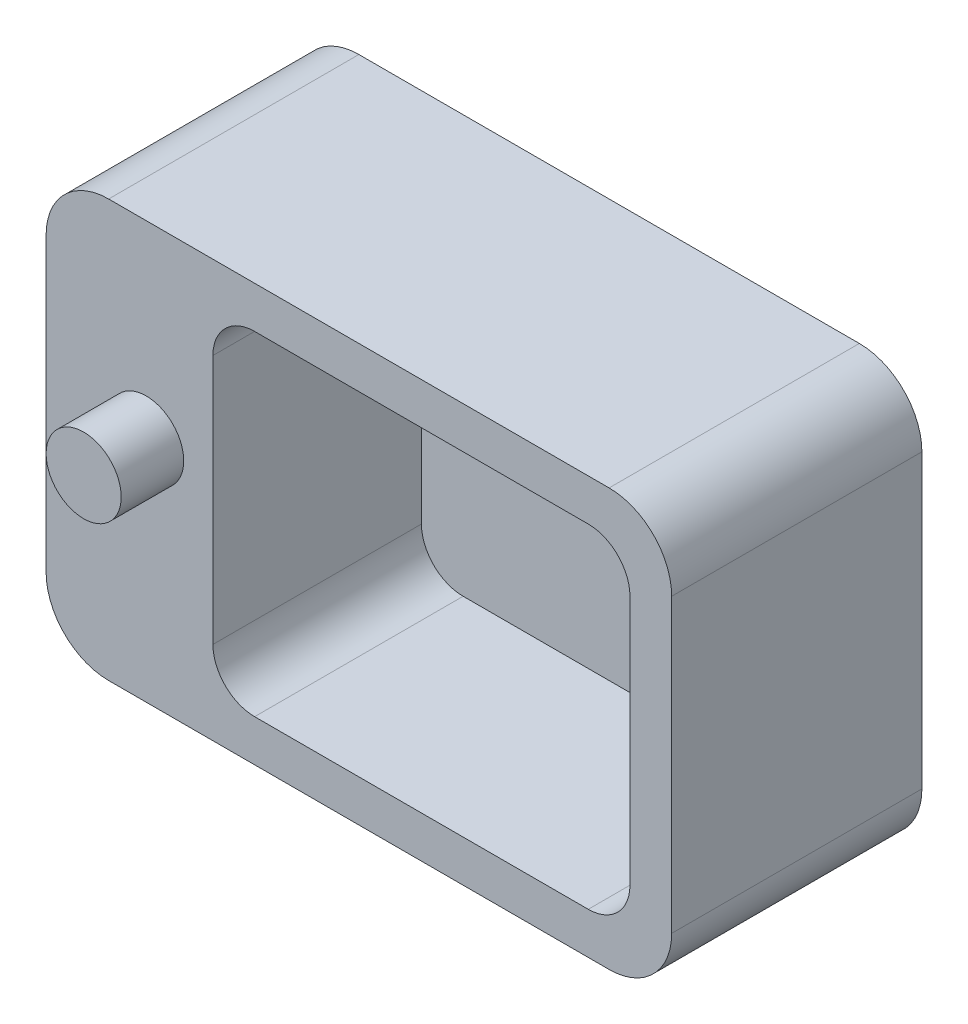
ISO-10303-21;
HEADER;
FILE_DESCRIPTION(('STEP AP214'),'2;1');
FILE_NAME('part.step','',(''),(''),'','','');
FILE_SCHEMA(('AUTOMOTIVE_DESIGN { 1 0 10303 214 1 1 1 1 }'));
ENDSEC;
DATA;
#1=APPLICATION_CONTEXT('core data for automotive mechanical design processes');
#2=APPLICATION_PROTOCOL_DEFINITION('international standard','automotive_design',2000,#1);
#3=PRODUCT_CONTEXT('',#1,'mechanical');
#4=PRODUCT('Part','Part','',(#3));
#5=PRODUCT_RELATED_PRODUCT_CATEGORY('part','',(#4));
#6=PRODUCT_DEFINITION_FORMATION('','',#4);
#7=PRODUCT_DEFINITION_CONTEXT('part definition',#1,'design');
#8=PRODUCT_DEFINITION('design','',#6,#7);
#9=PRODUCT_DEFINITION_SHAPE('','',#8);
#10=(LENGTH_UNIT() NAMED_UNIT(*) SI_UNIT(.MILLI.,.METRE.));
#11=(NAMED_UNIT(*) PLANE_ANGLE_UNIT() SI_UNIT($,.RADIAN.));
#12=(NAMED_UNIT(*) SI_UNIT($,.STERADIAN.) SOLID_ANGLE_UNIT());
#13=UNCERTAINTY_MEASURE_WITH_UNIT(LENGTH_MEASURE(1.E-05),#10,'distance_accuracy_value','');
#14=(GEOMETRIC_REPRESENTATION_CONTEXT(3) GLOBAL_UNCERTAINTY_ASSIGNED_CONTEXT((#13)) GLOBAL_UNIT_ASSIGNED_CONTEXT((#10,
#11,#12)) REPRESENTATION_CONTEXT('',''));
#15=CARTESIAN_POINT('',(0.,0.,0.));
#16=DIRECTION('',(0.,0.,1.));
#17=DIRECTION('',(1.,0.,0.));
#18=AXIS2_PLACEMENT_3D('',#15,#16,#17);
#19=CARTESIAN_POINT('',(135.,15.,60.));
#20=DIRECTION('',(0.,0.,-1.));
#21=DIRECTION('',(-1.,0.,0.));
#22=AXIS2_PLACEMENT_3D('',#19,#20,#21);
#23=PLANE('',#22);
#24=CARTESIAN_POINT('',(135.,15.,60.));
#25=DIRECTION('',(0.,0.,1.));
#26=DIRECTION('',(-1.,0.,0.));
#27=AXIS2_PLACEMENT_3D('',#24,#25,#26);
#28=CIRCLE('',#27,15.);
#29=CARTESIAN_POINT('',(135.,0.,60.));
#30=VERTEX_POINT('',#29);
#31=CARTESIAN_POINT('',(150.,15.,60.));
#32=VERTEX_POINT('',#31);
#33=EDGE_CURVE('E241',#30,#32,#28,.T.);
#34=ORIENTED_EDGE('',*,*,#33,.T.);
#35=DIRECTION('',(0.,1.,0.));
#36=VECTOR('',#35,1.);
#37=CARTESIAN_POINT('',(150.,15.,60.));
#38=LINE('',#37,#36);
#39=CARTESIAN_POINT('',(150.,85.,60.));
#40=VERTEX_POINT('',#39);
#41=EDGE_CURVE('E243',#32,#40,#38,.T.);
#42=ORIENTED_EDGE('',*,*,#41,.T.);
#43=CARTESIAN_POINT('',(135.,85.,60.));
#44=DIRECTION('',(0.,0.,1.));
#45=DIRECTION('',(1.,0.,0.));
#46=AXIS2_PLACEMENT_3D('',#43,#44,#45);
#47=CIRCLE('',#46,15.);
#48=CARTESIAN_POINT('',(135.,100.,60.));
#49=VERTEX_POINT('',#48);
#50=EDGE_CURVE('E245',#40,#49,#47,.T.);
#51=ORIENTED_EDGE('',*,*,#50,.T.);
#52=DIRECTION('',(-1.,0.,0.));
#53=VECTOR('',#52,1.);
#54=CARTESIAN_POINT('',(15.,100.,60.));
#55=LINE('',#54,#53);
#56=CARTESIAN_POINT('',(15.,100.,60.));
#57=VERTEX_POINT('',#56);
#58=EDGE_CURVE('E247',#49,#57,#55,.T.);
#59=ORIENTED_EDGE('',*,*,#58,.T.);
#60=CARTESIAN_POINT('',(15.,85.,60.));
#61=DIRECTION('',(0.,0.,1.));
#62=DIRECTION('',(1.,0.,0.));
#63=AXIS2_PLACEMENT_3D('',#60,#61,#62);
#64=CIRCLE('',#63,15.);
#65=CARTESIAN_POINT('',(0.,85.,60.));
#66=VERTEX_POINT('',#65);
#67=EDGE_CURVE('E249',#57,#66,#64,.T.);
#68=ORIENTED_EDGE('',*,*,#67,.T.);
#69=DIRECTION('',(0.,-1.,0.));
#70=VECTOR('',#69,1.);
#71=CARTESIAN_POINT('',(0.,15.,60.));
#72=LINE('',#71,#70);
#73=CARTESIAN_POINT('',(0.,15.,60.));
#74=VERTEX_POINT('',#73);
#75=EDGE_CURVE('E251',#66,#74,#72,.T.);
#76=ORIENTED_EDGE('',*,*,#75,.T.);
#77=CARTESIAN_POINT('',(15.,15.,60.));
#78=DIRECTION('',(0.,0.,1.));
#79=DIRECTION('',(1.,0.,0.));
#80=AXIS2_PLACEMENT_3D('',#77,#78,#79);
#81=CIRCLE('',#80,15.);
#82=CARTESIAN_POINT('',(15.,0.,60.));
#83=VERTEX_POINT('',#82);
#84=EDGE_CURVE('E253',#74,#83,#81,.T.);
#85=ORIENTED_EDGE('',*,*,#84,.T.);
#86=DIRECTION('',(1.,0.,0.));
#87=VECTOR('',#86,1.);
#88=CARTESIAN_POINT('',(15.,0.,60.));
#89=LINE('',#88,#87);
#90=EDGE_CURVE('E61',#83,#30,#89,.T.);
#91=ORIENTED_EDGE('',*,*,#90,.T.);
#92=EDGE_LOOP('',(#34,#42,#51,#59,#68,#76,#85,#91));
#93=FACE_BOUND('',#92,.T.);
#94=DIRECTION('',(0.,1.,0.));
#95=VECTOR('',#94,1.);
#96=CARTESIAN_POINT('',(140.,20.,60.));
#97=LINE('',#96,#95);
#98=CARTESIAN_POINT('',(140.,20.,60.));
#99=VERTEX_POINT('',#98);
#100=CARTESIAN_POINT('',(140.,80.,60.));
#101=VERTEX_POINT('',#100);
#102=EDGE_CURVE('E167',#99,#101,#97,.T.);
#103=ORIENTED_EDGE('',*,*,#102,.F.);
#104=CARTESIAN_POINT('',(130.,20.,60.));
#105=DIRECTION('',(0.,0.,1.));
#106=DIRECTION('',(-1.,0.,0.));
#107=AXIS2_PLACEMENT_3D('',#104,#105,#106);
#108=CIRCLE('',#107,10.);
#109=CARTESIAN_POINT('',(130.,10.,60.));
#110=VERTEX_POINT('',#109);
#111=EDGE_CURVE('E53',#110,#99,#108,.T.);
#112=ORIENTED_EDGE('',*,*,#111,.F.);
#113=DIRECTION('',(1.,0.,0.));
#114=VECTOR('',#113,1.);
#115=CARTESIAN_POINT('',(50.,10.,60.));
#116=LINE('',#115,#114);
#117=CARTESIAN_POINT('',(50.,10.,60.));
#118=VERTEX_POINT('',#117);
#119=EDGE_CURVE('E188',#118,#110,#116,.T.);
#120=ORIENTED_EDGE('',*,*,#119,.F.);
#121=CARTESIAN_POINT('',(50.,20.,60.));
#122=DIRECTION('',(0.,0.,1.));
#123=DIRECTION('',(1.,0.,0.));
#124=AXIS2_PLACEMENT_3D('',#121,#122,#123);
#125=CIRCLE('',#124,10.);
#126=CARTESIAN_POINT('',(40.,20.,60.));
#127=VERTEX_POINT('',#126);
#128=EDGE_CURVE('E185',#127,#118,#125,.T.);
#129=ORIENTED_EDGE('',*,*,#128,.F.);
#130=DIRECTION('',(0.,-1.,0.));
#131=VECTOR('',#130,1.);
#132=CARTESIAN_POINT('',(40.,80.,60.));
#133=LINE('',#132,#131);
#134=CARTESIAN_POINT('',(40.,80.,60.));
#135=VERTEX_POINT('',#134);
#136=EDGE_CURVE('E182',#135,#127,#133,.T.);
#137=ORIENTED_EDGE('',*,*,#136,.F.);
#138=CARTESIAN_POINT('',(50.,80.,60.));
#139=DIRECTION('',(0.,0.,1.));
#140=DIRECTION('',(1.,0.,0.));
#141=AXIS2_PLACEMENT_3D('',#138,#139,#140);
#142=CIRCLE('',#141,10.);
#143=CARTESIAN_POINT('',(50.,90.,60.));
#144=VERTEX_POINT('',#143);
#145=EDGE_CURVE('E176',#144,#135,#142,.T.);
#146=ORIENTED_EDGE('',*,*,#145,.F.);
#147=DIRECTION('',(-1.,0.,0.));
#148=VECTOR('',#147,1.);
#149=CARTESIAN_POINT('',(130.,90.,60.));
#150=LINE('',#149,#148);
#151=CARTESIAN_POINT('',(130.,90.,60.));
#152=VERTEX_POINT('',#151);
#153=EDGE_CURVE('E174',#152,#144,#150,.T.);
#154=ORIENTED_EDGE('',*,*,#153,.F.);
#155=CARTESIAN_POINT('',(130.,80.,60.));
#156=DIRECTION('',(0.,0.,1.));
#157=DIRECTION('',(-1.,0.,0.));
#158=AXIS2_PLACEMENT_3D('',#155,#156,#157);
#159=CIRCLE('',#158,10.);
#160=EDGE_CURVE('E156',#101,#152,#159,.T.);
#161=ORIENTED_EDGE('',*,*,#160,.F.);
#162=EDGE_LOOP('',(#103,#112,#120,#129,#137,#146,#154,#161));
#163=FACE_BOUND('',#162,.T.);
#164=CARTESIAN_POINT('',(24.,54.61,60.));
#165=DIRECTION('',(0.,0.,-1.));
#166=DIRECTION('',(-1.,0.,0.));
#167=AXIS2_PLACEMENT_3D('',#164,#165,#166);
#168=CIRCLE('',#167,9.00000000000001);
#169=CARTESIAN_POINT('',(15.,54.61,60.));
#170=VERTEX_POINT('',#169);
#171=EDGE_CURVE('E11',#170,#170,#168,.F.);
#172=ORIENTED_EDGE('',*,*,#171,.F.);
#173=EDGE_LOOP('',(#172));
#174=FACE_BOUND('',#173,.T.);
#175=ADVANCED_FACE('F38',(#93,#163,#174),#23,.F.);
#176=CARTESIAN_POINT('',(135.,15.,60.));
#177=DIRECTION('',(0.,0.,-1.));
#178=DIRECTION('',(-1.,0.,0.));
#179=AXIS2_PLACEMENT_3D('',#176,#177,#178);
#180=CYLINDRICAL_SURFACE('',#179,15.);
#181=CARTESIAN_POINT('',(135.,15.,0.));
#182=DIRECTION('',(0.,0.,1.));
#183=DIRECTION('',(-1.,0.,0.));
#184=AXIS2_PLACEMENT_3D('',#181,#182,#183);
#185=CIRCLE('',#184,15.);
#186=CARTESIAN_POINT('',(135.,0.,0.));
#187=VERTEX_POINT('',#186);
#188=CARTESIAN_POINT('',(150.,15.,0.));
#189=VERTEX_POINT('',#188);
#190=EDGE_CURVE('E214',#187,#189,#185,.T.);
#191=ORIENTED_EDGE('',*,*,#190,.T.);
#192=DIRECTION('',(0.,0.,-1.));
#193=VECTOR('',#192,1.);
#194=CARTESIAN_POINT('',(150.,15.,60.));
#195=LINE('',#194,#193);
#196=EDGE_CURVE('E46',#32,#189,#195,.T.);
#197=ORIENTED_EDGE('',*,*,#196,.F.);
#198=ORIENTED_EDGE('',*,*,#33,.F.);
#199=DIRECTION('',(0.,0.,-1.));
#200=VECTOR('',#199,1.);
#201=CARTESIAN_POINT('',(135.,0.,60.));
#202=LINE('',#201,#200);
#203=EDGE_CURVE('E256',#30,#187,#202,.T.);
#204=ORIENTED_EDGE('',*,*,#203,.T.);
#205=EDGE_LOOP('',(#191,#197,#198,#204));
#206=FACE_BOUND('',#205,.T.);
#207=ADVANCED_FACE('F40',(#206),#180,.T.);
#208=CARTESIAN_POINT('',(150.,15.,60.));
#209=DIRECTION('',(-1.,0.,0.));
#210=DIRECTION('',(0.,0.,1.));
#211=AXIS2_PLACEMENT_3D('',#208,#209,#210);
#212=PLANE('',#211);
#213=DIRECTION('',(0.,1.,0.));
#214=VECTOR('',#213,1.);
#215=CARTESIAN_POINT('',(150.,15.,0.));
#216=LINE('',#215,#214);
#217=CARTESIAN_POINT('',(150.,85.,0.));
#218=VERTEX_POINT('',#217);
#219=EDGE_CURVE('E227',#189,#218,#216,.T.);
#220=ORIENTED_EDGE('',*,*,#219,.T.);
#221=DIRECTION('',(0.,0.,-1.));
#222=VECTOR('',#221,1.);
#223=CARTESIAN_POINT('',(150.,85.,60.));
#224=LINE('',#223,#222);
#225=EDGE_CURVE('E274',#40,#218,#224,.T.);
#226=ORIENTED_EDGE('',*,*,#225,.F.);
#227=ORIENTED_EDGE('',*,*,#41,.F.);
#228=ORIENTED_EDGE('',*,*,#196,.T.);
#229=EDGE_LOOP('',(#220,#226,#227,#228));
#230=FACE_BOUND('',#229,.T.);
#231=ADVANCED_FACE('F279',(#230),#212,.F.);
#232=CARTESIAN_POINT('',(135.,85.,60.));
#233=DIRECTION('',(0.,0.,-1.));
#234=DIRECTION('',(-1.,0.,0.));
#235=AXIS2_PLACEMENT_3D('',#232,#233,#234);
#236=CYLINDRICAL_SURFACE('',#235,15.);
#237=CARTESIAN_POINT('',(135.,85.,0.));
#238=DIRECTION('',(0.,0.,1.));
#239=DIRECTION('',(1.,0.,0.));
#240=AXIS2_PLACEMENT_3D('',#237,#238,#239);
#241=CIRCLE('',#240,15.);
#242=CARTESIAN_POINT('',(135.,100.,0.));
#243=VERTEX_POINT('',#242);
#244=EDGE_CURVE('E229',#218,#243,#241,.T.);
#245=ORIENTED_EDGE('',*,*,#244,.T.);
#246=DIRECTION('',(0.,0.,-1.));
#247=VECTOR('',#246,1.);
#248=CARTESIAN_POINT('',(135.,100.,60.));
#249=LINE('',#248,#247);
#250=EDGE_CURVE('E271',#49,#243,#249,.T.);
#251=ORIENTED_EDGE('',*,*,#250,.F.);
#252=ORIENTED_EDGE('',*,*,#50,.F.);
#253=ORIENTED_EDGE('',*,*,#225,.T.);
#254=EDGE_LOOP('',(#245,#251,#252,#253));
#255=FACE_BOUND('',#254,.T.);
#256=ADVANCED_FACE('F293',(#255),#236,.T.);
#257=CARTESIAN_POINT('',(15.,100.,60.));
#258=DIRECTION('',(0.,-1.,0.));
#259=DIRECTION('',(1.,0.,0.));
#260=AXIS2_PLACEMENT_3D('',#257,#258,#259);
#261=PLANE('',#260);
#262=DIRECTION('',(-1.,0.,0.));
#263=VECTOR('',#262,1.);
#264=CARTESIAN_POINT('',(15.,100.,0.));
#265=LINE('',#264,#263);
#266=CARTESIAN_POINT('',(15.,100.,0.));
#267=VERTEX_POINT('',#266);
#268=EDGE_CURVE('E231',#243,#267,#265,.T.);
#269=ORIENTED_EDGE('',*,*,#268,.T.);
#270=DIRECTION('',(0.,0.,-1.));
#271=VECTOR('',#270,1.);
#272=CARTESIAN_POINT('',(15.,100.,60.));
#273=LINE('',#272,#271);
#274=EDGE_CURVE('E268',#57,#267,#273,.T.);
#275=ORIENTED_EDGE('',*,*,#274,.F.);
#276=ORIENTED_EDGE('',*,*,#58,.F.);
#277=ORIENTED_EDGE('',*,*,#250,.T.);
#278=EDGE_LOOP('',(#269,#275,#276,#277));
#279=FACE_BOUND('',#278,.T.);
#280=ADVANCED_FACE('F297',(#279),#261,.F.);
#281=CARTESIAN_POINT('',(15.,85.,60.));
#282=DIRECTION('',(0.,0.,-1.));
#283=DIRECTION('',(-1.,0.,0.));
#284=AXIS2_PLACEMENT_3D('',#281,#282,#283);
#285=CYLINDRICAL_SURFACE('',#284,15.);
#286=CARTESIAN_POINT('',(15.,85.,0.));
#287=DIRECTION('',(0.,0.,1.));
#288=DIRECTION('',(1.,0.,0.));
#289=AXIS2_PLACEMENT_3D('',#286,#287,#288);
#290=CIRCLE('',#289,15.);
#291=CARTESIAN_POINT('',(0.,85.,0.));
#292=VERTEX_POINT('',#291);
#293=EDGE_CURVE('E233',#267,#292,#290,.T.);
#294=ORIENTED_EDGE('',*,*,#293,.T.);
#295=DIRECTION('',(0.,0.,-1.));
#296=VECTOR('',#295,1.);
#297=CARTESIAN_POINT('',(0.,85.,60.));
#298=LINE('',#297,#296);
#299=EDGE_CURVE('E265',#66,#292,#298,.T.);
#300=ORIENTED_EDGE('',*,*,#299,.F.);
#301=ORIENTED_EDGE('',*,*,#67,.F.);
#302=ORIENTED_EDGE('',*,*,#274,.T.);
#303=EDGE_LOOP('',(#294,#300,#301,#302));
#304=FACE_BOUND('',#303,.T.);
#305=ADVANCED_FACE('F304',(#304),#285,.T.);
#306=CARTESIAN_POINT('',(0.,15.,60.));
#307=DIRECTION('',(1.,0.,0.));
#308=DIRECTION('',(0.,0.,-1.));
#309=AXIS2_PLACEMENT_3D('',#306,#307,#308);
#310=PLANE('',#309);
#311=DIRECTION('',(0.,-1.,0.));
#312=VECTOR('',#311,1.);
#313=CARTESIAN_POINT('',(0.,15.,0.));
#314=LINE('',#313,#312);
#315=CARTESIAN_POINT('',(0.,15.,0.));
#316=VERTEX_POINT('',#315);
#317=EDGE_CURVE('E235',#292,#316,#314,.T.);
#318=ORIENTED_EDGE('',*,*,#317,.T.);
#319=DIRECTION('',(0.,0.,-1.));
#320=VECTOR('',#319,1.);
#321=CARTESIAN_POINT('',(0.,15.,60.));
#322=LINE('',#321,#320);
#323=EDGE_CURVE('E262',#74,#316,#322,.T.);
#324=ORIENTED_EDGE('',*,*,#323,.F.);
#325=ORIENTED_EDGE('',*,*,#75,.F.);
#326=ORIENTED_EDGE('',*,*,#299,.T.);
#327=EDGE_LOOP('',(#318,#324,#325,#326));
#328=FACE_BOUND('',#327,.T.);
#329=ADVANCED_FACE('F307',(#328),#310,.F.);
#330=CARTESIAN_POINT('',(15.,15.,60.));
#331=DIRECTION('',(0.,0.,-1.));
#332=DIRECTION('',(-1.,0.,0.));
#333=AXIS2_PLACEMENT_3D('',#330,#331,#332);
#334=CYLINDRICAL_SURFACE('',#333,15.);
#335=CARTESIAN_POINT('',(15.,15.,0.));
#336=DIRECTION('',(0.,0.,1.));
#337=DIRECTION('',(1.,0.,0.));
#338=AXIS2_PLACEMENT_3D('',#335,#336,#337);
#339=CIRCLE('',#338,15.);
#340=CARTESIAN_POINT('',(15.,0.,0.));
#341=VERTEX_POINT('',#340);
#342=EDGE_CURVE('E237',#316,#341,#339,.T.);
#343=ORIENTED_EDGE('',*,*,#342,.T.);
#344=DIRECTION('',(0.,0.,-1.));
#345=VECTOR('',#344,1.);
#346=CARTESIAN_POINT('',(15.,0.,60.));
#347=LINE('',#346,#345);
#348=EDGE_CURVE('E259',#83,#341,#347,.T.);
#349=ORIENTED_EDGE('',*,*,#348,.F.);
#350=ORIENTED_EDGE('',*,*,#84,.F.);
#351=ORIENTED_EDGE('',*,*,#323,.T.);
#352=EDGE_LOOP('',(#343,#349,#350,#351));
#353=FACE_BOUND('',#352,.T.);
#354=ADVANCED_FACE('F311',(#353),#334,.T.);
#355=CARTESIAN_POINT('',(15.,0.,60.));
#356=DIRECTION('',(0.,1.,0.));
#357=DIRECTION('',(0.,0.,1.));
#358=AXIS2_PLACEMENT_3D('',#355,#356,#357);
#359=PLANE('',#358);
#360=DIRECTION('',(1.,0.,0.));
#361=VECTOR('',#360,1.);
#362=CARTESIAN_POINT('',(15.,0.,0.));
#363=LINE('',#362,#361);
#364=EDGE_CURVE('E239',#341,#187,#363,.T.);
#365=ORIENTED_EDGE('',*,*,#364,.T.);
#366=ORIENTED_EDGE('',*,*,#203,.F.);
#367=ORIENTED_EDGE('',*,*,#90,.F.);
#368=ORIENTED_EDGE('',*,*,#348,.T.);
#369=EDGE_LOOP('',(#365,#366,#367,#368));
#370=FACE_BOUND('',#369,.T.);
#371=ADVANCED_FACE('F313',(#370),#359,.F.);
#372=CARTESIAN_POINT('',(135.,15.,0.));
#373=DIRECTION('',(0.,0.,-1.));
#374=DIRECTION('',(-1.,0.,0.));
#375=AXIS2_PLACEMENT_3D('',#372,#373,#374);
#376=PLANE('',#375);
#377=ORIENTED_EDGE('',*,*,#190,.F.);
#378=ORIENTED_EDGE('',*,*,#364,.F.);
#379=ORIENTED_EDGE('',*,*,#342,.F.);
#380=ORIENTED_EDGE('',*,*,#317,.F.);
#381=ORIENTED_EDGE('',*,*,#293,.F.);
#382=ORIENTED_EDGE('',*,*,#268,.F.);
#383=ORIENTED_EDGE('',*,*,#244,.F.);
#384=ORIENTED_EDGE('',*,*,#219,.F.);
#385=EDGE_LOOP('',(#377,#378,#379,#380,#381,#382,#383,#384));
#386=FACE_BOUND('',#385,.T.);
#387=ADVANCED_FACE('F286',(#386),#376,.T.);
#388=CARTESIAN_POINT('',(130.,20.,10.));
#389=DIRECTION('',(0.,0.,1.));
#390=DIRECTION('',(1.,0.,0.));
#391=AXIS2_PLACEMENT_3D('',#388,#389,#390);
#392=CYLINDRICAL_SURFACE('',#391,10.);
#393=ORIENTED_EDGE('',*,*,#111,.T.);
#394=DIRECTION('',(0.,0.,1.));
#395=VECTOR('',#394,1.);
#396=CARTESIAN_POINT('',(140.,20.,10.));
#397=LINE('',#396,#395);
#398=CARTESIAN_POINT('',(140.,20.,10.));
#399=VERTEX_POINT('',#398);
#400=EDGE_CURVE('E164',#399,#99,#397,.T.);
#401=ORIENTED_EDGE('',*,*,#400,.F.);
#402=CARTESIAN_POINT('',(130.,20.,10.));
#403=DIRECTION('',(0.,0.,1.));
#404=DIRECTION('',(-1.,0.,0.));
#405=AXIS2_PLACEMENT_3D('',#402,#403,#404);
#406=CIRCLE('',#405,10.);
#407=CARTESIAN_POINT('',(130.,10.,10.));
#408=VERTEX_POINT('',#407);
#409=EDGE_CURVE('E191',#408,#399,#406,.T.);
#410=ORIENTED_EDGE('',*,*,#409,.F.);
#411=DIRECTION('',(0.,0.,1.));
#412=VECTOR('',#411,1.);
#413=CARTESIAN_POINT('',(130.,10.,10.));
#414=LINE('',#413,#412);
#415=EDGE_CURVE('E212',#408,#110,#414,.T.);
#416=ORIENTED_EDGE('',*,*,#415,.T.);
#417=EDGE_LOOP('',(#393,#401,#410,#416));
#418=FACE_BOUND('',#417,.T.);
#419=ADVANCED_FACE('F320',(#418),#392,.F.);
#420=CARTESIAN_POINT('',(50.,10.,10.));
#421=DIRECTION('',(0.,-1.,0.));
#422=DIRECTION('',(0.,0.,-1.));
#423=AXIS2_PLACEMENT_3D('',#420,#421,#422);
#424=PLANE('',#423);
#425=ORIENTED_EDGE('',*,*,#119,.T.);
#426=ORIENTED_EDGE('',*,*,#415,.F.);
#427=DIRECTION('',(1.,0.,0.));
#428=VECTOR('',#427,1.);
#429=CARTESIAN_POINT('',(50.,10.,10.));
#430=LINE('',#429,#428);
#431=CARTESIAN_POINT('',(50.,10.,10.));
#432=VERTEX_POINT('',#431);
#433=EDGE_CURVE('E209',#432,#408,#430,.T.);
#434=ORIENTED_EDGE('',*,*,#433,.F.);
#435=DIRECTION('',(0.,0.,1.));
#436=VECTOR('',#435,1.);
#437=CARTESIAN_POINT('',(50.,10.,10.));
#438=LINE('',#437,#436);
#439=EDGE_CURVE('E215',#432,#118,#438,.T.);
#440=ORIENTED_EDGE('',*,*,#439,.T.);
#441=EDGE_LOOP('',(#425,#426,#434,#440));
#442=FACE_BOUND('',#441,.T.);
#443=ADVANCED_FACE('F331',(#442),#424,.F.);
#444=CARTESIAN_POINT('',(50.,20.,10.));
#445=DIRECTION('',(0.,0.,1.));
#446=DIRECTION('',(1.,0.,0.));
#447=AXIS2_PLACEMENT_3D('',#444,#445,#446);
#448=CYLINDRICAL_SURFACE('',#447,10.);
#449=ORIENTED_EDGE('',*,*,#128,.T.);
#450=ORIENTED_EDGE('',*,*,#439,.F.);
#451=CARTESIAN_POINT('',(50.,20.,10.));
#452=DIRECTION('',(0.,0.,1.));
#453=DIRECTION('',(1.,0.,0.));
#454=AXIS2_PLACEMENT_3D('',#451,#452,#453);
#455=CIRCLE('',#454,10.);
#456=CARTESIAN_POINT('',(40.,20.,10.));
#457=VERTEX_POINT('',#456);
#458=EDGE_CURVE('E206',#457,#432,#455,.T.);
#459=ORIENTED_EDGE('',*,*,#458,.F.);
#460=DIRECTION('',(0.,0.,1.));
#461=VECTOR('',#460,1.);
#462=CARTESIAN_POINT('',(40.,20.,10.));
#463=LINE('',#462,#461);
#464=EDGE_CURVE('E217',#457,#127,#463,.T.);
#465=ORIENTED_EDGE('',*,*,#464,.T.);
#466=EDGE_LOOP('',(#449,#450,#459,#465));
#467=FACE_BOUND('',#466,.T.);
#468=ADVANCED_FACE('F348',(#467),#448,.F.);
#469=CARTESIAN_POINT('',(40.,80.,10.));
#470=DIRECTION('',(-1.,0.,0.));
#471=DIRECTION('',(0.,-1.,0.));
#472=AXIS2_PLACEMENT_3D('',#469,#470,#471);
#473=PLANE('',#472);
#474=ORIENTED_EDGE('',*,*,#136,.T.);
#475=ORIENTED_EDGE('',*,*,#464,.F.);
#476=DIRECTION('',(0.,-1.,0.));
#477=VECTOR('',#476,1.);
#478=CARTESIAN_POINT('',(40.,80.,10.));
#479=LINE('',#478,#477);
#480=CARTESIAN_POINT('',(40.,80.,10.));
#481=VERTEX_POINT('',#480);
#482=EDGE_CURVE('E203',#481,#457,#479,.T.);
#483=ORIENTED_EDGE('',*,*,#482,.F.);
#484=DIRECTION('',(0.,0.,1.));
#485=VECTOR('',#484,1.);
#486=CARTESIAN_POINT('',(40.,80.,10.));
#487=LINE('',#486,#485);
#488=EDGE_CURVE('E219',#481,#135,#487,.T.);
#489=ORIENTED_EDGE('',*,*,#488,.T.);
#490=EDGE_LOOP('',(#474,#475,#483,#489));
#491=FACE_BOUND('',#490,.T.);
#492=ADVANCED_FACE('F344',(#491),#473,.F.);
#493=CARTESIAN_POINT('',(50.,80.,10.));
#494=DIRECTION('',(0.,0.,1.));
#495=DIRECTION('',(1.,0.,0.));
#496=AXIS2_PLACEMENT_3D('',#493,#494,#495);
#497=CYLINDRICAL_SURFACE('',#496,10.);
#498=ORIENTED_EDGE('',*,*,#145,.T.);
#499=ORIENTED_EDGE('',*,*,#488,.F.);
#500=CARTESIAN_POINT('',(50.,80.,10.));
#501=DIRECTION('',(0.,0.,1.));
#502=DIRECTION('',(1.,0.,0.));
#503=AXIS2_PLACEMENT_3D('',#500,#501,#502);
#504=CIRCLE('',#503,10.);
#505=CARTESIAN_POINT('',(50.,90.,10.));
#506=VERTEX_POINT('',#505);
#507=EDGE_CURVE('E200',#506,#481,#504,.T.);
#508=ORIENTED_EDGE('',*,*,#507,.F.);
#509=DIRECTION('',(0.,0.,1.));
#510=VECTOR('',#509,1.);
#511=CARTESIAN_POINT('',(50.,90.,10.));
#512=LINE('',#511,#510);
#513=EDGE_CURVE('E221',#506,#144,#512,.T.);
#514=ORIENTED_EDGE('',*,*,#513,.T.);
#515=EDGE_LOOP('',(#498,#499,#508,#514));
#516=FACE_BOUND('',#515,.T.);
#517=ADVANCED_FACE('F340',(#516),#497,.F.);
#518=CARTESIAN_POINT('',(130.,90.,10.));
#519=DIRECTION('',(0.,1.,0.));
#520=DIRECTION('',(0.,0.,1.));
#521=AXIS2_PLACEMENT_3D('',#518,#519,#520);
#522=PLANE('',#521);
#523=ORIENTED_EDGE('',*,*,#153,.T.);
#524=ORIENTED_EDGE('',*,*,#513,.F.);
#525=DIRECTION('',(-1.,0.,0.));
#526=VECTOR('',#525,1.);
#527=CARTESIAN_POINT('',(130.,90.,10.));
#528=LINE('',#527,#526);
#529=CARTESIAN_POINT('',(130.,90.,10.));
#530=VERTEX_POINT('',#529);
#531=EDGE_CURVE('E197',#530,#506,#528,.T.);
#532=ORIENTED_EDGE('',*,*,#531,.F.);
#533=DIRECTION('',(0.,0.,1.));
#534=VECTOR('',#533,1.);
#535=CARTESIAN_POINT('',(130.,90.,10.));
#536=LINE('',#535,#534);
#537=EDGE_CURVE('E163',#530,#152,#536,.T.);
#538=ORIENTED_EDGE('',*,*,#537,.T.);
#539=EDGE_LOOP('',(#523,#524,#532,#538));
#540=FACE_BOUND('',#539,.T.);
#541=ADVANCED_FACE('F337',(#540),#522,.F.);
#542=CARTESIAN_POINT('',(130.,80.,10.));
#543=DIRECTION('',(0.,0.,1.));
#544=DIRECTION('',(1.,0.,0.));
#545=AXIS2_PLACEMENT_3D('',#542,#543,#544);
#546=CYLINDRICAL_SURFACE('',#545,10.);
#547=ORIENTED_EDGE('',*,*,#160,.T.);
#548=ORIENTED_EDGE('',*,*,#537,.F.);
#549=CARTESIAN_POINT('',(130.,80.,10.));
#550=DIRECTION('',(0.,0.,1.));
#551=DIRECTION('',(-1.,0.,0.));
#552=AXIS2_PLACEMENT_3D('',#549,#550,#551);
#553=CIRCLE('',#552,10.);
#554=CARTESIAN_POINT('',(140.,80.,10.));
#555=VERTEX_POINT('',#554);
#556=EDGE_CURVE('E159',#555,#530,#553,.T.);
#557=ORIENTED_EDGE('',*,*,#556,.F.);
#558=DIRECTION('',(0.,0.,1.));
#559=VECTOR('',#558,1.);
#560=CARTESIAN_POINT('',(140.,80.,10.));
#561=LINE('',#560,#559);
#562=EDGE_CURVE('E152',#555,#101,#561,.T.);
#563=ORIENTED_EDGE('',*,*,#562,.T.);
#564=EDGE_LOOP('',(#547,#548,#557,#563));
#565=FACE_BOUND('',#564,.T.);
#566=ADVANCED_FACE('F154',(#565),#546,.F.);
#567=CARTESIAN_POINT('',(140.,20.,10.));
#568=DIRECTION('',(1.,0.,0.));
#569=DIRECTION('',(0.,1.,0.));
#570=AXIS2_PLACEMENT_3D('',#567,#568,#569);
#571=PLANE('',#570);
#572=ORIENTED_EDGE('',*,*,#102,.T.);
#573=ORIENTED_EDGE('',*,*,#562,.F.);
#574=DIRECTION('',(0.,1.,0.));
#575=VECTOR('',#574,1.);
#576=CARTESIAN_POINT('',(140.,20.,10.));
#577=LINE('',#576,#575);
#578=EDGE_CURVE('E194',#399,#555,#577,.T.);
#579=ORIENTED_EDGE('',*,*,#578,.F.);
#580=ORIENTED_EDGE('',*,*,#400,.T.);
#581=EDGE_LOOP('',(#572,#573,#579,#580));
#582=FACE_BOUND('',#581,.T.);
#583=ADVANCED_FACE('F168',(#582),#571,.F.);
#584=CARTESIAN_POINT('',(130.,20.,10.));
#585=DIRECTION('',(0.,0.,-1.));
#586=DIRECTION('',(-1.,0.,0.));
#587=AXIS2_PLACEMENT_3D('',#584,#585,#586);
#588=PLANE('',#587);
#589=ORIENTED_EDGE('',*,*,#409,.T.);
#590=ORIENTED_EDGE('',*,*,#578,.T.);
#591=ORIENTED_EDGE('',*,*,#556,.T.);
#592=ORIENTED_EDGE('',*,*,#531,.T.);
#593=ORIENTED_EDGE('',*,*,#507,.T.);
#594=ORIENTED_EDGE('',*,*,#482,.T.);
#595=ORIENTED_EDGE('',*,*,#458,.T.);
#596=ORIENTED_EDGE('',*,*,#433,.T.);
#597=EDGE_LOOP('',(#589,#590,#591,#592,#593,#594,#595,#596));
#598=FACE_BOUND('',#597,.T.);
#599=ADVANCED_FACE('F334',(#598),#588,.F.);
#600=CARTESIAN_POINT('',(24.,54.61,75.));
#601=DIRECTION('',(0.,0.,-1.));
#602=DIRECTION('',(-1.,0.,0.));
#603=AXIS2_PLACEMENT_3D('',#600,#601,#602);
#604=CYLINDRICAL_SURFACE('',#603,9.00000000000001);
#605=CARTESIAN_POINT('',(24.,54.61,75.));
#606=DIRECTION('',(0.,0.,1.));
#607=DIRECTION('',(1.,0.,0.));
#608=AXIS2_PLACEMENT_3D('',#605,#606,#607);
#609=CIRCLE('',#608,9.00000000000001);
#610=CARTESIAN_POINT('',(33.,54.61,75.));
#611=VERTEX_POINT('',#610);
#612=EDGE_CURVE('E370',#611,#611,#609,.T.);
#613=ORIENTED_EDGE('',*,*,#612,.F.);
#614=EDGE_LOOP('',(#613));
#615=FACE_BOUND('',#614,.T.);
#616=ORIENTED_EDGE('',*,*,#171,.T.);
#617=EDGE_LOOP('',(#616));
#618=FACE_BOUND('',#617,.T.);
#619=ADVANCED_FACE('F358',(#615,#618),#604,.T.);
#620=CARTESIAN_POINT('',(24.,54.61,75.));
#621=DIRECTION('',(0.,0.,1.));
#622=DIRECTION('',(1.,0.,0.));
#623=AXIS2_PLACEMENT_3D('',#620,#621,#622);
#624=PLANE('',#623);
#625=ORIENTED_EDGE('',*,*,#612,.T.);
#626=EDGE_LOOP('',(#625));
#627=FACE_BOUND('',#626,.T.);
#628=ADVANCED_FACE('F362',(#627),#624,.T.);
#629=CLOSED_SHELL('',(#175,#207,#231,#256,#280,#305,#329,#354,#371,#387,#419,#443,#468,#492,
#517,#541,#566,#583,#599,#619,#628));
#630=MANIFOLD_SOLID_BREP('B2',#629);
#631=ADVANCED_BREP_SHAPE_REPRESENTATION('',(#18,#630),#14);
#632=SHAPE_DEFINITION_REPRESENTATION(#9,#631);
ENDSEC;
END-ISO-10303-21;
